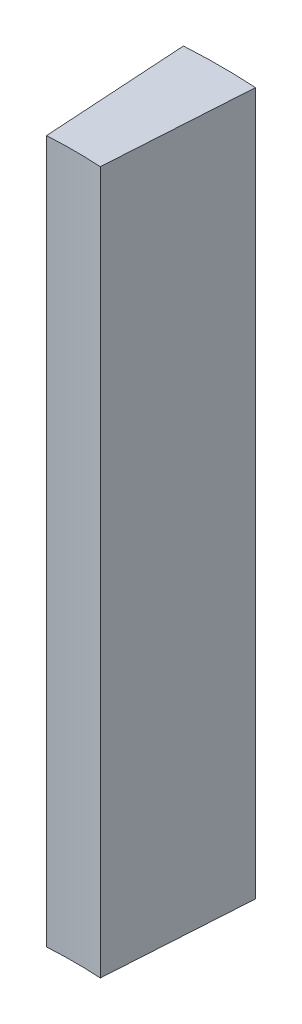
ISO-10303-21;
HEADER;
FILE_DESCRIPTION(('STEP AP214'),'2;1');
FILE_NAME('part.step','',(''),(''),'','','');
FILE_SCHEMA(('AUTOMOTIVE_DESIGN { 1 0 10303 214 1 1 1 1 }'));
ENDSEC;
DATA;
#1=APPLICATION_CONTEXT('core data for automotive mechanical design processes');
#2=APPLICATION_PROTOCOL_DEFINITION('international standard','automotive_design',2000,#1);
#3=PRODUCT_CONTEXT('',#1,'mechanical');
#4=PRODUCT('Part','Part','',(#3));
#5=PRODUCT_RELATED_PRODUCT_CATEGORY('part','',(#4));
#6=PRODUCT_DEFINITION_FORMATION('','',#4);
#7=PRODUCT_DEFINITION_CONTEXT('part definition',#1,'design');
#8=PRODUCT_DEFINITION('design','',#6,#7);
#9=PRODUCT_DEFINITION_SHAPE('','',#8);
#10=(LENGTH_UNIT() NAMED_UNIT(*) SI_UNIT(.MILLI.,.METRE.));
#11=(NAMED_UNIT(*) PLANE_ANGLE_UNIT() SI_UNIT($,.RADIAN.));
#12=(NAMED_UNIT(*) SI_UNIT($,.STERADIAN.) SOLID_ANGLE_UNIT());
#13=UNCERTAINTY_MEASURE_WITH_UNIT(LENGTH_MEASURE(1.E-05),#10,'distance_accuracy_value','');
#14=(GEOMETRIC_REPRESENTATION_CONTEXT(3) GLOBAL_UNCERTAINTY_ASSIGNED_CONTEXT((#13)) GLOBAL_UNIT_ASSIGNED_CONTEXT((#10,
#11,#12)) REPRESENTATION_CONTEXT('',''));
#15=CARTESIAN_POINT('',(0.,0.,0.));
#16=DIRECTION('',(0.,0.,1.));
#17=DIRECTION('',(1.,0.,0.));
#18=AXIS2_PLACEMENT_3D('',#15,#16,#17);
#19=CARTESIAN_POINT('',(-31.1603296744771,48.,1.25421817028242));
#20=DIRECTION('',(0.,-1.,0.));
#21=DIRECTION('',(0.,0.,-1.));
#22=AXIS2_PLACEMENT_3D('',#19,#20,#21);
#23=CYLINDRICAL_SURFACE('',#22,39.522);
#24=CARTESIAN_POINT('',(-31.1603296744771,0.,1.25421817028242));
#25=DIRECTION('',(0.,1.,0.));
#26=DIRECTION('',(0.,0.,1.));
#27=AXIS2_PLACEMENT_3D('',#24,#25,#26);
#28=CIRCLE('',#27,39.522);
#29=CARTESIAN_POINT('',(-28.6984260473694,0.,-38.1910288758553));
#30=VERTEX_POINT('',#29);
#31=CARTESIAN_POINT('',(-33.6222038499913,0.,-38.1910307140121));
#32=VERTEX_POINT('',#31);
#33=EDGE_CURVE('E104',#30,#32,#28,.T.);
#34=ORIENTED_EDGE('',*,*,#33,.T.);
#35=DIRECTION('',(0.,-1.,0.));
#36=VECTOR('',#35,1.);
#37=CARTESIAN_POINT('',(-33.6222038499913,48.,-38.1910307140121));
#38=LINE('',#37,#36);
#39=CARTESIAN_POINT('',(-33.6222038499913,48.,-38.1910307140121));
#40=VERTEX_POINT('',#39);
#41=EDGE_CURVE('E11',#40,#32,#38,.T.);
#42=ORIENTED_EDGE('',*,*,#41,.F.);
#43=CARTESIAN_POINT('',(-31.1603296744771,48.,1.25421817028242));
#44=DIRECTION('',(0.,1.,0.));
#45=DIRECTION('',(0.,0.,1.));
#46=AXIS2_PLACEMENT_3D('',#43,#44,#45);
#47=CIRCLE('',#46,39.522);
#48=CARTESIAN_POINT('',(-28.6984260473694,48.,-38.1910288758553));
#49=VERTEX_POINT('',#48);
#50=EDGE_CURVE('E92',#49,#40,#47,.T.);
#51=ORIENTED_EDGE('',*,*,#50,.F.);
#52=DIRECTION('',(0.,-1.,0.));
#53=VECTOR('',#52,1.);
#54=CARTESIAN_POINT('',(-28.6984260473694,48.,-38.1910288758553));
#55=LINE('',#54,#53);
#56=EDGE_CURVE('E100',#49,#30,#55,.T.);
#57=ORIENTED_EDGE('',*,*,#56,.T.);
#58=EDGE_LOOP('',(#34,#42,#51,#57));
#59=FACE_BOUND('',#58,.T.);
#60=ADVANCED_FACE('F41',(#59),#23,.T.);
#61=CARTESIAN_POINT('',(-33.6222038499913,48.,-38.1910307140121));
#62=DIRECTION('',(0.998052722524365,0.,-0.062375981448813));
#63=DIRECTION('',(-0.062375981448813,0.,-0.998052722524365));
#64=AXIS2_PLACEMENT_3D('',#61,#62,#63);
#65=PLANE('',#64);
#66=DIRECTION('',(0.062375981448813,0.,0.998052722524365));
#67=VECTOR('',#66,1.);
#68=CARTESIAN_POINT('',(-33.6222038499913,0.,-38.1910307140121));
#69=LINE('',#68,#67);
#70=CARTESIAN_POINT('',(-32.9984440324928,0.,-28.2105034406009));
#71=VERTEX_POINT('',#70);
#72=EDGE_CURVE('E96',#32,#71,#69,.T.);
#73=ORIENTED_EDGE('',*,*,#72,.T.);
#74=DIRECTION('',(0.,-1.,0.));
#75=VECTOR('',#74,1.);
#76=CARTESIAN_POINT('',(-32.9984440324928,48.,-28.2105034406009));
#77=LINE('',#76,#75);
#78=CARTESIAN_POINT('',(-32.9984440324928,48.,-28.2105034406009));
#79=VERTEX_POINT('',#78);
#80=EDGE_CURVE('E49',#79,#71,#77,.T.);
#81=ORIENTED_EDGE('',*,*,#80,.F.);
#82=DIRECTION('',(0.062375981448813,0.,0.998052722524365));
#83=VECTOR('',#82,1.);
#84=CARTESIAN_POINT('',(-33.6222038499913,48.,-38.1910307140121));
#85=LINE('',#84,#83);
#86=EDGE_CURVE('E87',#40,#79,#85,.T.);
#87=ORIENTED_EDGE('',*,*,#86,.F.);
#88=ORIENTED_EDGE('',*,*,#41,.T.);
#89=EDGE_LOOP('',(#73,#81,#87,#88));
#90=FACE_BOUND('',#89,.T.);
#91=ADVANCED_FACE('F95',(#90),#65,.F.);
#92=CARTESIAN_POINT('',(-31.1603296744771,48.,1.25421817028242));
#93=DIRECTION('',(0.,-1.,0.));
#94=DIRECTION('',(0.,0.,-1.));
#95=AXIS2_PLACEMENT_3D('',#92,#93,#94);
#96=CYLINDRICAL_SURFACE('',#95,29.522);
#97=CARTESIAN_POINT('',(-31.1603296744771,0.,1.25421817028242));
#98=DIRECTION('',(0.,-1.,0.));
#99=DIRECTION('',(0.,0.,1.));
#100=AXIS2_PLACEMENT_3D('',#97,#98,#99);
#101=CIRCLE('',#100,29.522);
#102=CARTESIAN_POINT('',(-29.3222153164614,0.,-28.2105034406009));
#103=VERTEX_POINT('',#102);
#104=EDGE_CURVE('E74',#71,#103,#101,.T.);
#105=ORIENTED_EDGE('',*,*,#104,.T.);
#106=DIRECTION('',(0.,-1.,0.));
#107=VECTOR('',#106,1.);
#108=CARTESIAN_POINT('',(-29.3222153164614,48.,-28.2105034406009));
#109=LINE('',#108,#107);
#110=CARTESIAN_POINT('',(-29.3222153164614,48.,-28.2105034406009));
#111=VERTEX_POINT('',#110);
#112=EDGE_CURVE('E97',#111,#103,#109,.T.);
#113=ORIENTED_EDGE('',*,*,#112,.F.);
#114=CARTESIAN_POINT('',(-31.1603296744771,48.,1.25421817028242));
#115=DIRECTION('',(0.,-1.,0.));
#116=DIRECTION('',(0.,0.,1.));
#117=AXIS2_PLACEMENT_3D('',#114,#115,#116);
#118=CIRCLE('',#117,29.522);
#119=EDGE_CURVE('E90',#79,#111,#118,.T.);
#120=ORIENTED_EDGE('',*,*,#119,.F.);
#121=ORIENTED_EDGE('',*,*,#80,.T.);
#122=EDGE_LOOP('',(#105,#113,#120,#121));
#123=FACE_BOUND('',#122,.T.);
#124=ADVANCED_FACE('F98',(#123),#96,.F.);
#125=CARTESIAN_POINT('',(-28.6984260473694,48.,-38.1910288758553));
#126=DIRECTION('',(-0.998052538455361,0.,-0.0623789265923184));
#127=DIRECTION('',(-0.0623789265923184,0.,0.998052538455361));
#128=AXIS2_PLACEMENT_3D('',#125,#126,#127);
#129=PLANE('',#128);
#130=DIRECTION('',(0.0623789265923184,0.,-0.998052538455361));
#131=VECTOR('',#130,1.);
#132=CARTESIAN_POINT('',(-28.6984260473694,0.,-38.1910288758553));
#133=LINE('',#132,#131);
#134=EDGE_CURVE('E80',#103,#30,#133,.T.);
#135=ORIENTED_EDGE('',*,*,#134,.T.);
#136=ORIENTED_EDGE('',*,*,#56,.F.);
#137=DIRECTION('',(0.0623789265923184,0.,-0.998052538455361));
#138=VECTOR('',#137,1.);
#139=CARTESIAN_POINT('',(-28.6984260473694,48.,-38.1910288758553));
#140=LINE('',#139,#138);
#141=EDGE_CURVE('E57',#111,#49,#140,.T.);
#142=ORIENTED_EDGE('',*,*,#141,.F.);
#143=ORIENTED_EDGE('',*,*,#112,.T.);
#144=EDGE_LOOP('',(#135,#136,#142,#143));
#145=FACE_BOUND('',#144,.T.);
#146=ADVANCED_FACE('F111',(#145),#129,.F.);
#147=CARTESIAN_POINT('',(-31.1603296744771,48.,1.25421817028242));
#148=DIRECTION('',(0.,1.,0.));
#149=DIRECTION('',(0.,0.,1.));
#150=AXIS2_PLACEMENT_3D('',#147,#148,#149);
#151=PLANE('',#150);
#152=ORIENTED_EDGE('',*,*,#50,.T.);
#153=ORIENTED_EDGE('',*,*,#86,.T.);
#154=ORIENTED_EDGE('',*,*,#119,.T.);
#155=ORIENTED_EDGE('',*,*,#141,.T.);
#156=EDGE_LOOP('',(#152,#153,#154,#155));
#157=FACE_BOUND('',#156,.T.);
#158=ADVANCED_FACE('F88',(#157),#151,.T.);
#159=CARTESIAN_POINT('',(-31.1603296744771,0.,1.25421817028242));
#160=DIRECTION('',(0.,1.,0.));
#161=DIRECTION('',(0.,0.,1.));
#162=AXIS2_PLACEMENT_3D('',#159,#160,#161);
#163=PLANE('',#162);
#164=ORIENTED_EDGE('',*,*,#33,.F.);
#165=ORIENTED_EDGE('',*,*,#134,.F.);
#166=ORIENTED_EDGE('',*,*,#104,.F.);
#167=ORIENTED_EDGE('',*,*,#72,.F.);
#168=EDGE_LOOP('',(#164,#165,#166,#167));
#169=FACE_BOUND('',#168,.T.);
#170=ADVANCED_FACE('F114',(#169),#163,.F.);
#171=CLOSED_SHELL('',(#60,#91,#124,#146,#158,#170));
#172=MANIFOLD_SOLID_BREP('B2',#171);
#173=ADVANCED_BREP_SHAPE_REPRESENTATION('',(#18,#172),#14);
#174=SHAPE_DEFINITION_REPRESENTATION(#9,#173);
ENDSEC;
END-ISO-10303-21;
